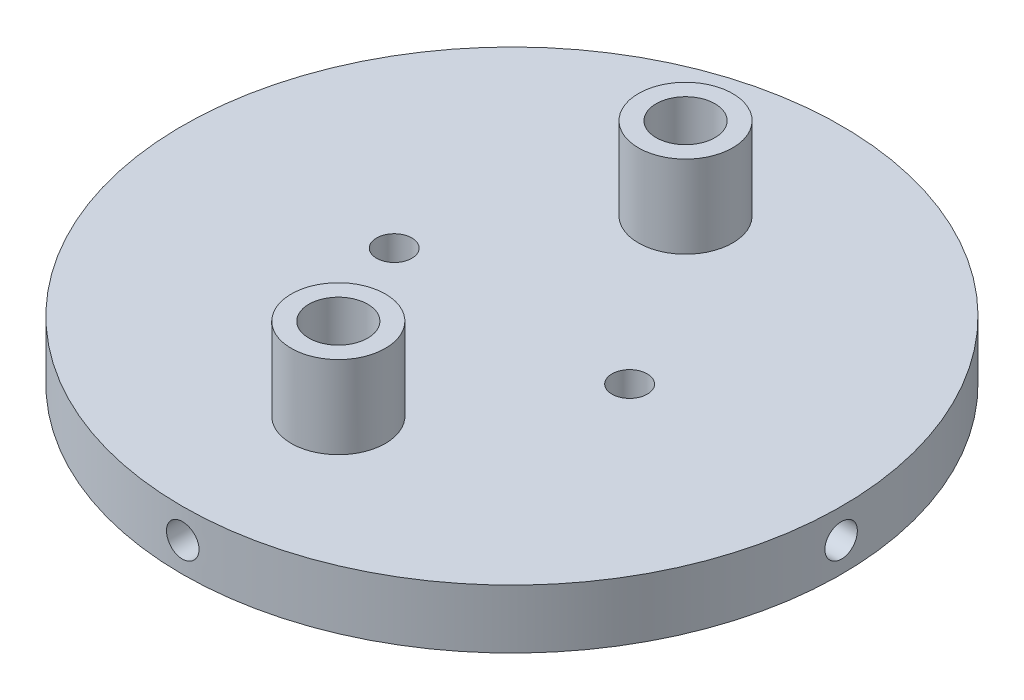
ISO-10303-21;
HEADER;
FILE_DESCRIPTION(('STEP AP214'),'2;1');
FILE_NAME('part.step','',(''),(''),'','','');
FILE_SCHEMA(('AUTOMOTIVE_DESIGN { 1 0 10303 214 1 1 1 1 }'));
ENDSEC;
DATA;
#1=APPLICATION_CONTEXT('core data for automotive mechanical design processes');
#2=APPLICATION_PROTOCOL_DEFINITION('international standard','automotive_design',2000,#1);
#3=PRODUCT_CONTEXT('',#1,'mechanical');
#4=PRODUCT('Part','Part','',(#3));
#5=PRODUCT_RELATED_PRODUCT_CATEGORY('part','',(#4));
#6=PRODUCT_DEFINITION_FORMATION('','',#4);
#7=PRODUCT_DEFINITION_CONTEXT('part definition',#1,'design');
#8=PRODUCT_DEFINITION('design','',#6,#7);
#9=PRODUCT_DEFINITION_SHAPE('','',#8);
#10=(LENGTH_UNIT() NAMED_UNIT(*) SI_UNIT(.MILLI.,.METRE.));
#11=(NAMED_UNIT(*) PLANE_ANGLE_UNIT() SI_UNIT($,.RADIAN.));
#12=(NAMED_UNIT(*) SI_UNIT($,.STERADIAN.) SOLID_ANGLE_UNIT());
#13=UNCERTAINTY_MEASURE_WITH_UNIT(LENGTH_MEASURE(1.E-05),#10,'distance_accuracy_value','');
#14=(GEOMETRIC_REPRESENTATION_CONTEXT(3) GLOBAL_UNCERTAINTY_ASSIGNED_CONTEXT((#13)) GLOBAL_UNIT_ASSIGNED_CONTEXT((#10,
#11,#12)) REPRESENTATION_CONTEXT('',''));
#15=CARTESIAN_POINT('',(0.,0.,0.));
#16=DIRECTION('',(0.,0.,1.));
#17=DIRECTION('',(1.,0.,0.));
#18=AXIS2_PLACEMENT_3D('',#15,#16,#17);
#19=CARTESIAN_POINT('',(0.,6.35,0.));
#20=DIRECTION('',(0.,-1.,0.));
#21=DIRECTION('',(0.,0.,-1.));
#22=AXIS2_PLACEMENT_3D('',#19,#20,#21);
#23=CYLINDRICAL_SURFACE('',#22,35.56);
#24=CARTESIAN_POINT('',(1.75260000000002,3.175,35.5167846692236));
#25=CARTESIAN_POINT('',(1.75259565748174,3.07661985264155,35.5167852498599));
#26=CARTESIAN_POINT('',(1.74428849712468,2.97816989228284,35.517197826552));
#27=CARTESIAN_POINT('',(1.71126732995226,2.78398573728596,35.5188038486097));
#28=CARTESIAN_POINT('',(1.68653397994158,2.68825488337661,35.5199982145728));
#29=CARTESIAN_POINT('',(1.62137019269568,2.50235000214616,35.5230321965141));
#30=CARTESIAN_POINT('',(1.58094774311842,2.41217317417732,35.5248714841029));
#31=CARTESIAN_POINT('',(1.48556542875144,2.2399092758522,35.5289876438377));
#32=CARTESIAN_POINT('',(1.43060900066078,2.15782029933565,35.5312644125024));
#33=CARTESIAN_POINT('',(1.3076582223125,2.00395675455581,35.5360015585401));
#34=CARTESIAN_POINT('',(1.23965265226458,1.9321911560295,35.5384620927965));
#35=CARTESIAN_POINT('',(1.09255637307995,1.80108797575915,35.5432880338743));
#36=CARTESIAN_POINT('',(1.01346521217627,1.74175090075604,35.5456534368139));
#37=CARTESIAN_POINT('',(0.846396334855018,1.63716477394104,35.5500237525702));
#38=CARTESIAN_POINT('',(0.758414272885256,1.59192265577467,35.5520284877616));
#39=CARTESIAN_POINT('',(0.576091687714351,1.51685521652007,35.5554499785934));
#40=CARTESIAN_POINT('',(0.481751211634678,1.48702978119479,35.5568667385906));
#41=CARTESIAN_POINT('',(0.289471817195192,1.44366589096916,35.5589515795177));
#42=CARTESIAN_POINT('',(0.191535914619937,1.43011409375883,35.5596202737355));
#43=CARTESIAN_POINT('',(-0.00522278880340807,1.41964099207441,35.5601356835175));
#44=CARTESIAN_POINT('',(-0.10404558281864,1.422719559585,35.559982405409));
#45=CARTESIAN_POINT('',(-0.299682507959631,1.44540872022766,35.5588716603791));
#46=CARTESIAN_POINT('',(-0.396498309274552,1.46500495111244,35.5579148921017));
#47=CARTESIAN_POINT('',(-0.585464506105232,1.52015091145531,35.5553057425343));
#48=CARTESIAN_POINT('',(-0.677614882467505,1.55570070640342,35.5536533583888));
#49=CARTESIAN_POINT('',(-0.854680665274876,1.64176104699676,35.5498379086647));
#50=CARTESIAN_POINT('',(-0.939592885375323,1.69227813811922,35.5476746197421));
#51=CARTESIAN_POINT('',(-1.09973717871644,1.80683429312375,35.543080988105));
#52=CARTESIAN_POINT('',(-1.17496918563918,1.87087344963586,35.5406506435611));
#53=CARTESIAN_POINT('',(-1.31370125336173,2.01073709632467,35.5357935519409));
#54=CARTESIAN_POINT('',(-1.3771887529248,2.08657404701148,35.5333668114387));
#55=CARTESIAN_POINT('',(-1.49053286475763,2.24783676779311,35.5287931102323));
#56=CARTESIAN_POINT('',(-1.54038947348171,2.33326254038218,35.5266461496009));
#57=CARTESIAN_POINT('',(-1.62505544885416,2.51128553954154,35.5228743163687));
#58=CARTESIAN_POINT('',(-1.65986434604472,2.60388298974724,35.521249460057));
#59=CARTESIAN_POINT('',(-1.71343842513358,2.79361742812011,35.5187056949691));
#60=CARTESIAN_POINT('',(-1.73220372427588,2.89075438310785,35.5177867810339));
#61=CARTESIAN_POINT('',(-1.75314239893088,3.08670105298232,35.5167594791941));
#62=CARTESIAN_POINT('',(-1.75533320749854,3.1855089007237,35.516650239676));
#63=CARTESIAN_POINT('',(-1.74310620281234,3.3820887380129,35.5172523822966));
#64=CARTESIAN_POINT('',(-1.72868844289776,3.4798607308864,35.5179637617999));
#65=CARTESIAN_POINT('',(-1.68366802640658,3.67154451531251,35.520126185297));
#66=CARTESIAN_POINT('',(-1.65307334665796,3.76545818482633,35.5215768647298));
#67=CARTESIAN_POINT('',(-1.57657563468257,3.94681730028211,35.5250540720692));
#68=CARTESIAN_POINT('',(-1.53067251641459,4.03426270986579,35.5270806032124));
#69=CARTESIAN_POINT('',(-1.42481619788519,4.20028325837599,35.5314831765588));
#70=CARTESIAN_POINT('',(-1.36485128598656,4.27885092202821,35.5338595094836));
#71=CARTESIAN_POINT('',(-1.23259067801519,4.42481054123364,35.5386928243905));
#72=CARTESIAN_POINT('',(-1.160294905215,4.49220242724164,35.5411498068743));
#73=CARTESIAN_POINT('',(-1.00534992011121,4.6139560474327,35.5458699820804));
#74=CARTESIAN_POINT('',(-0.922691854216096,4.66830652185362,35.5481330062663));
#75=CARTESIAN_POINT('',(-0.749413409746863,4.7623575341947,35.5522078085963));
#76=CARTESIAN_POINT('',(-0.658793065094452,4.802058134524,35.5540195886628));
#77=CARTESIAN_POINT('',(-0.472204353385614,4.86566275208892,35.5569869071518));
#78=CARTESIAN_POINT('',(-0.376238448098622,4.88957397658114,35.5581427449532));
#79=CARTESIAN_POINT('',(-0.181648250536128,4.9209446942958,35.5596691057493));
#80=CARTESIAN_POINT('',(-0.0830239727004411,4.92840427686247,35.5600396330087));
#81=CARTESIAN_POINT('',(0.113971607472735,4.92665910268187,35.5599536336804));
#82=CARTESIAN_POINT('',(0.21234306717315,4.91747201053862,35.5594979837896));
#83=CARTESIAN_POINT('',(0.406145184380198,4.88273078389109,35.5578126535167));
#84=CARTESIAN_POINT('',(0.501575836331461,4.85717661847037,35.5565829716725));
#85=CARTESIAN_POINT('',(0.686791181041931,4.79043022165202,35.5534879313447));
#86=CARTESIAN_POINT('',(0.776575829073077,4.74923786638569,35.551622567826));
#87=CARTESIAN_POINT('',(0.947955875937594,4.65238751010222,35.5474659664367));
#88=CARTESIAN_POINT('',(1.02955152802435,4.59672995662788,35.5451747417426));
#89=CARTESIAN_POINT('',(1.18232549419748,4.47246608048212,35.5404215493862));
#90=CARTESIAN_POINT('',(1.25349382142881,4.40384748637129,35.5379594213224));
#91=CARTESIAN_POINT('',(1.38332292689591,4.25561662367362,35.5331429863574));
#92=CARTESIAN_POINT('',(1.44198062262948,4.17600165362592,35.5307887061409));
#93=CARTESIAN_POINT('',(1.54515013231447,4.00797678396374,35.5264519514601));
#94=CARTESIAN_POINT('',(1.58964851435119,3.91955863716084,35.5244698307627));
#95=CARTESIAN_POINT('',(1.66311553994467,3.73656275288202,35.5211065695754));
#96=CARTESIAN_POINT('',(1.69210253472609,3.64199244321005,35.519724719283));
#97=CARTESIAN_POINT('',(1.72611708279803,3.48486176583137,35.5180838625486));
#98=CARTESIAN_POINT('',(1.73603550572586,3.42331926608273,35.5175988122841));
#99=CARTESIAN_POINT('',(1.74927833605916,3.29952716914497,35.5169490319747));
#100=CARTESIAN_POINT('',(1.75260274894382,3.23727757254344,35.5167843016635));
#101=CARTESIAN_POINT('',(1.75260000000002,3.175,35.5167846692236));
#102=B_SPLINE_CURVE_WITH_KNOTS('',3,(#24,#25,#26,#27,#28,#29,#30,#31,#32,#33,#34,#35,#36,#37,
#38,#39,#40,#41,#42,#43,#44,#45,#46,#47,#48,#49,#50,#51,#52,#53,#54,#55,#56,#57,#58,#59,#60,#61,
#62,#63,#64,#65,#66,#67,#68,#69,#70,#71,#72,#73,#74,#75,#76,#77,#78,#79,#80,#81,#82,#83,#84,#85,
#86,#87,#88,#89,#90,#91,#92,#93,#94,#95,#96,#97,#98,#99,#100,#101),.UNSPECIFIED.,.T.,.F.,(4,2,2,
2,2,2,2,2,2,2,2,2,2,2,2,2,2,2,2,2,2,2,2,2,2,2,2,2,2,2,2,2,2,2,2,2,2,2,4),(0.,0.29491310564371,
0.590174113071641,0.885284993540475,1.18032615449809,1.47562214098343,1.77093016505713,
2.06638322964928,2.36183410491369,2.65704258235578,2.95224878737911,3.24719857259496,
3.5421495686026,3.83722974304003,4.13231193892732,4.42770793543048,4.72310400877219,
5.01850929720166,5.31391242683889,5.60900480810767,5.90409624167445,6.19904230137218,
6.49399001884486,6.78918426723068,7.08438035249766,7.37983039596048,7.6752791807781,
7.97059301093437,8.26590523732063,8.56090427690143,8.85590387371975,9.15090580725236,
9.44589861472427,9.74117213254942,10.0365183191666,10.3321438497632,10.6274188538465,
10.8141078158496,11.0007966227267),.UNSPECIFIED.);
#103=CARTESIAN_POINT('',(1.75260000000002,3.175,35.5167846692236));
#104=VERTEX_POINT('',#103);
#105=EDGE_CURVE('E45',#104,#104,#102,.T.);
#106=ORIENTED_EDGE('',*,*,#105,.T.);
#107=EDGE_LOOP('',(#106));
#108=FACE_BOUND('',#107,.T.);
#109=CARTESIAN_POINT('',(-35.5167846692236,3.175,1.7526));
#110=CARTESIAN_POINT('',(-35.5167852498599,3.07661985264155,1.75259565748173));
#111=CARTESIAN_POINT('',(-35.517197826552,2.97816989228284,1.74428849712466));
#112=CARTESIAN_POINT('',(-35.5188038486097,2.78398573728596,1.71126732995224));
#113=CARTESIAN_POINT('',(-35.5199982145728,2.68825488337661,1.68653397994156));
#114=CARTESIAN_POINT('',(-35.5230321965141,2.50235000214616,1.62137019269566));
#115=CARTESIAN_POINT('',(-35.5248714841029,2.41217317417732,1.5809477431184));
#116=CARTESIAN_POINT('',(-35.5289876438377,2.2399092758522,1.48556542875142));
#117=CARTESIAN_POINT('',(-35.5312644125024,2.15782029933565,1.43060900066076));
#118=CARTESIAN_POINT('',(-35.5360015585401,2.00395675455581,1.30765822231248));
#119=CARTESIAN_POINT('',(-35.5384620927965,1.9321911560295,1.23965265226456));
#120=CARTESIAN_POINT('',(-35.5432880338743,1.80108797575915,1.09255637307993));
#121=CARTESIAN_POINT('',(-35.5456534368139,1.74175090075604,1.01346521217625));
#122=CARTESIAN_POINT('',(-35.5500237525702,1.63716477394104,0.846396334855001));
#123=CARTESIAN_POINT('',(-35.5520284877616,1.59192265577467,0.758414272885239));
#124=CARTESIAN_POINT('',(-35.5554499785934,1.51685521652007,0.576091687714333));
#125=CARTESIAN_POINT('',(-35.5568667385906,1.48702978119479,0.48175121163466));
#126=CARTESIAN_POINT('',(-35.5589515795177,1.44366589096916,0.289471817195175));
#127=CARTESIAN_POINT('',(-35.5596202737355,1.43011409375883,0.191535914619919));
#128=CARTESIAN_POINT('',(-35.5601356835175,1.41964099207441,-0.00522278880342564));
#129=CARTESIAN_POINT('',(-35.559982405409,1.422719559585,-0.104045582818658));
#130=CARTESIAN_POINT('',(-35.5588716603791,1.44540872022766,-0.299682507959649));
#131=CARTESIAN_POINT('',(-35.5579148921017,1.46500495111244,-0.39649830927457));
#132=CARTESIAN_POINT('',(-35.5553057425343,1.52015091145531,-0.585464506105249));
#133=CARTESIAN_POINT('',(-35.5536533583888,1.55570070640342,-0.677614882467522));
#134=CARTESIAN_POINT('',(-35.5498379086647,1.64176104699676,-0.854680665274893));
#135=CARTESIAN_POINT('',(-35.5476746197421,1.69227813811922,-0.939592885375341));
#136=CARTESIAN_POINT('',(-35.543080988105,1.80683429312375,-1.09973717871646));
#137=CARTESIAN_POINT('',(-35.5406506435611,1.87087344963586,-1.17496918563919));
#138=CARTESIAN_POINT('',(-35.5357935519409,2.01073709632467,-1.31370125336175));
#139=CARTESIAN_POINT('',(-35.5333668114387,2.08657404701148,-1.37718875292482));
#140=CARTESIAN_POINT('',(-35.5287931102323,2.24783676779311,-1.49053286475765));
#141=CARTESIAN_POINT('',(-35.5266461496009,2.33326254038218,-1.54038947348173));
#142=CARTESIAN_POINT('',(-35.5228743163687,2.51128553954154,-1.62505544885417));
#143=CARTESIAN_POINT('',(-35.521249460057,2.60388298974724,-1.65986434604474));
#144=CARTESIAN_POINT('',(-35.5187056949691,2.79361742812011,-1.7134384251336));
#145=CARTESIAN_POINT('',(-35.5177867810339,2.89075438310785,-1.7322037242759));
#146=CARTESIAN_POINT('',(-35.5167594791941,3.08670105298232,-1.75314239893089));
#147=CARTESIAN_POINT('',(-35.516650239676,3.1855089007237,-1.75533320749856));
#148=CARTESIAN_POINT('',(-35.5172523822966,3.3820887380129,-1.74310620281236));
#149=CARTESIAN_POINT('',(-35.5179637617999,3.4798607308864,-1.72868844289778));
#150=CARTESIAN_POINT('',(-35.520126185297,3.67154451531251,-1.6836680264066));
#151=CARTESIAN_POINT('',(-35.5215768647298,3.76545818482633,-1.65307334665798));
#152=CARTESIAN_POINT('',(-35.5250540720692,3.94681730028211,-1.57657563468259));
#153=CARTESIAN_POINT('',(-35.5270806032124,4.03426270986579,-1.53067251641461));
#154=CARTESIAN_POINT('',(-35.5314831765588,4.20028325837599,-1.42481619788521));
#155=CARTESIAN_POINT('',(-35.5338595094836,4.27885092202821,-1.36485128598658));
#156=CARTESIAN_POINT('',(-35.5386928243905,4.42481054123364,-1.23259067801521));
#157=CARTESIAN_POINT('',(-35.5411498068743,4.49220242724164,-1.16029490521502));
#158=CARTESIAN_POINT('',(-35.5458699820804,4.6139560474327,-1.00534992011123));
#159=CARTESIAN_POINT('',(-35.5481330062663,4.66830652185362,-0.922691854216115));
#160=CARTESIAN_POINT('',(-35.5522078085963,4.7623575341947,-0.749413409746882));
#161=CARTESIAN_POINT('',(-35.5540195886628,4.802058134524,-0.658793065094471));
#162=CARTESIAN_POINT('',(-35.5569869071518,4.86566275208892,-0.472204353385632));
#163=CARTESIAN_POINT('',(-35.5581427449532,4.88957397658114,-0.37623844809864));
#164=CARTESIAN_POINT('',(-35.5596691057493,4.9209446942958,-0.181648250536146));
#165=CARTESIAN_POINT('',(-35.5600396330087,4.92840427686247,-0.0830239727004598));
#166=CARTESIAN_POINT('',(-35.5599536336804,4.92665910268187,0.113971607472717));
#167=CARTESIAN_POINT('',(-35.5594979837896,4.91747201053862,0.212343067173132));
#168=CARTESIAN_POINT('',(-35.5578126535167,4.8827307838911,0.40614518438018));
#169=CARTESIAN_POINT('',(-35.5565829716725,4.85717661847037,0.501575836331443));
#170=CARTESIAN_POINT('',(-35.5534879313447,4.79043022165202,0.686791181041913));
#171=CARTESIAN_POINT('',(-35.551622567826,4.74923786638569,0.776575829073059));
#172=CARTESIAN_POINT('',(-35.5474659664367,4.65238751010222,0.947955875937576));
#173=CARTESIAN_POINT('',(-35.5451747417426,4.59672995662788,1.02955152802433));
#174=CARTESIAN_POINT('',(-35.5404215493862,4.47246608048212,1.18232549419747));
#175=CARTESIAN_POINT('',(-35.5379594213224,4.40384748637129,1.25349382142879));
#176=CARTESIAN_POINT('',(-35.5331429863574,4.25561662367362,1.38332292689589));
#177=CARTESIAN_POINT('',(-35.5307887061409,4.17600165362592,1.44198062262946));
#178=CARTESIAN_POINT('',(-35.5264519514601,4.00797678396374,1.54515013231446));
#179=CARTESIAN_POINT('',(-35.5244698307627,3.91955863716084,1.58964851435117));
#180=CARTESIAN_POINT('',(-35.5211065695754,3.73656275288203,1.66311553994465));
#181=CARTESIAN_POINT('',(-35.519724719283,3.64199244321005,1.69210253472607));
#182=CARTESIAN_POINT('',(-35.5180838625486,3.48486176583137,1.72611708279802));
#183=CARTESIAN_POINT('',(-35.5175988122841,3.42331926608273,1.73603550572584));
#184=CARTESIAN_POINT('',(-35.5169490319747,3.29952716914497,1.74927833605915));
#185=CARTESIAN_POINT('',(-35.5167843016635,3.23727757254344,1.75260274894381));
#186=CARTESIAN_POINT('',(-35.5167846692236,3.175,1.7526));
#187=B_SPLINE_CURVE_WITH_KNOTS('',3,(#109,#110,#111,#112,#113,#114,#115,#116,#117,#118,#119,
#120,#121,#122,#123,#124,#125,#126,#127,#128,#129,#130,#131,#132,#133,#134,#135,#136,#137,#138,
#139,#140,#141,#142,#143,#144,#145,#146,#147,#148,#149,#150,#151,#152,#153,#154,#155,#156,#157,
#158,#159,#160,#161,#162,#163,#164,#165,#166,#167,#168,#169,#170,#171,#172,#173,#174,#175,#176,
#177,#178,#179,#180,#181,#182,#183,#184,#185,#186),.UNSPECIFIED.,.T.,.F.,(4,2,2,2,2,2,2,2,2,2,2,
2,2,2,2,2,2,2,2,2,2,2,2,2,2,2,2,2,2,2,2,2,2,2,2,2,2,2,4),(0.,0.29491310564371,0.590174113071641,
0.885284993540474,1.18032615449809,1.47562214098343,1.77093016505713,2.06638322964928,
2.36183410491369,2.65704258235578,2.95224878737911,3.24719857259496,3.5421495686026,
3.83722974304003,4.13231193892732,4.42770793543048,4.72310400877219,5.01850929720166,
5.31391242683889,5.60900480810767,5.90409624167445,6.19904230137219,6.49399001884486,
6.78918426723068,7.08438035249766,7.37983039596048,7.6752791807781,7.97059301093438,
8.26590523732063,8.56090427690143,8.85590387371975,9.15090580725236,9.44589861472428,
9.74117213254942,10.0365183191666,10.3321438497632,10.6274188538465,10.8141078158496,
11.0007966227267),.UNSPECIFIED.);
#188=CARTESIAN_POINT('',(-35.5167846692236,3.175,1.7526));
#189=VERTEX_POINT('',#188);
#190=EDGE_CURVE('E154',#189,#189,#187,.T.);
#191=ORIENTED_EDGE('',*,*,#190,.T.);
#192=EDGE_LOOP('',(#191));
#193=FACE_BOUND('',#192,.T.);
#194=CARTESIAN_POINT('',(0.,4.9276,-35.56));
#195=CARTESIAN_POINT('',(-0.0983802291936352,4.92759565755605,-35.5599994219985));
#196=CARTESIAN_POINT('',(-0.196830271108554,4.91928848384639,-35.5595873592893));
#197=CARTESIAN_POINT('',(-0.391014595567187,4.88626725881109,-35.5579831734438));
#198=CARTESIAN_POINT('',(-0.486745537445925,4.86153386456723,-35.5567901306777));
#199=CARTESIAN_POINT('',(-0.672650604626898,4.79636994790484,-35.5537590205327));
#200=CARTESIAN_POINT('',(-0.762827529831678,4.75594741103382,-35.5519212813405));
#201=CARTESIAN_POINT('',(-0.935091590835963,4.66056489114558,-35.5478077663485));
#202=CARTESIAN_POINT('',(-1.01718063291898,4.60560834504409,-35.5455320941429));
#203=CARTESIAN_POINT('',(-1.17104410266456,4.48265744790439,-35.5407962153809));
#204=CARTESIAN_POINT('',(-1.24280958159614,4.41465190339939,-35.5383358515066));
#205=CARTESIAN_POINT('',(-1.37391253133227,4.26755572538041,-35.5335092448212));
#206=CARTESIAN_POINT('',(-1.43324949502956,4.18846463977478,-35.5311430058539));
#207=CARTESIAN_POINT('',(-1.53783550622896,4.02139582743557,-35.5267703741939));
#208=CARTESIAN_POINT('',(-1.58307759942614,3.93341374221048,-35.5247641593409));
#209=CARTESIAN_POINT('',(-1.65814498608772,3.75109110647012,-35.5213397180878));
#210=CARTESIAN_POINT('',(-1.68797039409191,3.65675060320123,-35.5199214873191));
#211=CARTESIAN_POINT('',(-1.73133422607455,3.46447112954339,-35.5178343605855));
#212=CARTESIAN_POINT('',(-1.74488599036769,3.36653517449752,-35.5171648508877));
#213=CARTESIAN_POINT('',(-1.75535900804197,3.16977636863586,-35.5166488223706));
#214=CARTESIAN_POINT('',(-1.75228038978589,3.07095352467146,-35.5168022971991));
#215=CARTESIAN_POINT('',(-1.7295911496435,2.87531682558643,-35.5179143601368));
#216=CARTESIAN_POINT('',(-1.70999494106321,2.77850129431971,-35.5188722463111));
#217=CARTESIAN_POINT('',(-1.65484911926599,2.58953562609783,-35.5214840623631));
#218=CARTESIAN_POINT('',(-1.619299440062,2.4973855084416,-35.5231379951197));
#219=CARTESIAN_POINT('',(-1.53323933737755,2.32032003596024,-35.5269562993211));
#220=CARTESIAN_POINT('',(-1.48272234112627,2.23540788076458,-35.5291208949338));
#221=CARTESIAN_POINT('',(-1.36816638767416,2.07526367683178,-35.533716323019));
#222=CARTESIAN_POINT('',(-1.30412733790252,2.00003169436994,-35.5361471573141));
#223=CARTESIAN_POINT('',(-1.16426376589558,1.86129950293786,-35.5410042018898));
#224=CARTESIAN_POINT('',(-1.08842676162411,1.7978118768446,-35.5434304044861));
#225=CARTESIAN_POINT('',(-0.927163888926762,1.68446753540475,-35.5480022321837));
#226=CARTESIAN_POINT('',(-0.841738018185195,1.63461082334999,-35.5501478572173));
#227=CARTESIAN_POINT('',(-0.663714994646261,1.54994477401755,-35.5539168031496));
#228=CARTESIAN_POINT('',(-0.57111763359593,1.51513587390673,-35.5555401088735));
#229=CARTESIAN_POINT('',(-0.381383388679273,1.46156176156002,-35.5580812431837));
#230=CARTESIAN_POINT('',(-0.284246537842983,1.44279643260778,-35.5589990769023));
#231=CARTESIAN_POINT('',(-0.0882999128859692,1.42185764587093,-35.5600251652618));
#232=CARTESIAN_POINT('',(0.0105079971264113,1.41966678338142,-35.5601342691407));
#233=CARTESIAN_POINT('',(0.207087971988984,1.43189370246011,-35.5595328560243));
#234=CARTESIAN_POINT('',(0.304860040165148,1.44631143068368,-35.5588223416615));
#235=CARTESIAN_POINT('',(0.496544181311631,1.49133185935453,-35.556662268026));
#236=CARTESIAN_POINT('',(0.590458124740743,1.52192661478895,-35.5552130715545));
#237=CARTESIAN_POINT('',(0.771817754445081,1.59842457009321,-35.5517387997729));
#238=CARTESIAN_POINT('',(0.859263404548951,1.64432785556202,-35.5497137212429));
#239=CARTESIAN_POINT('',(1.02528411147932,1.75018441708132,-35.5453133951609));
#240=CARTESIAN_POINT('',(1.10385172016371,1.81014936222601,-35.5429378573903));
#241=CARTESIAN_POINT('',(1.24981121293105,1.9424100056554,-35.5381051203537));
#242=CARTESIAN_POINT('',(1.31720302723442,2.01470578092578,-35.5356479205781));
#243=CARTESIAN_POINT('',(1.43895650024278,2.16965073362179,-35.5309263930996));
#244=CARTESIAN_POINT('',(1.49330689942494,2.25230876441812,-35.5286622331402));
#245=CARTESIAN_POINT('',(1.58735777958946,2.42558711936228,-35.5245847380342));
#246=CARTESIAN_POINT('',(1.62705832297741,2.51620740959038,-35.5227714009672));
#247=CARTESIAN_POINT('',(1.69066290113323,2.70279616196548,-35.5198012289192));
#248=CARTESIAN_POINT('',(1.71457411853316,2.79876217074838,-35.5186440954623));
#249=CARTESIAN_POINT('',(1.74594478696655,2.99335258595711,-35.5171159759293));
#250=CARTESIAN_POINT('',(1.75340432789203,3.09197697785456,-35.5167449855576));
#251=CARTESIAN_POINT('',(1.75165903556183,3.28897248029566,-35.5168310951867));
#252=CARTESIAN_POINT('',(1.74247191647223,3.38734374865679,-35.5172873149309));
#253=CARTESIAN_POINT('',(1.70773070340058,3.58114547665607,-35.5189745651462));
#254=CARTESIAN_POINT('',(1.68217657815881,3.67657593067714,-35.5202055970971));
#255=CARTESIAN_POINT('',(1.61543033268378,3.86179089045634,-35.5233035269703));
#256=CARTESIAN_POINT('',(1.57423808867415,3.95157535151964,-35.5251704299255));
#257=CARTESIAN_POINT('',(1.47738801251041,4.122955071113,-35.5293296257034));
#258=CARTESIAN_POINT('',(1.42173062769699,4.20455058278169,-35.5316219053705));
#259=CARTESIAN_POINT('',(1.29746693335908,4.35732456597216,-35.5363762696639));
#260=CARTESIAN_POINT('',(1.22884831409021,4.42849301951069,-35.5388385142897));
#261=CARTESIAN_POINT('',(1.08061734962977,4.55832236802268,-35.5436541849854));
#262=CARTESIAN_POINT('',(1.00100230325088,4.6169801808191,-35.546007584128));
#263=CARTESIAN_POINT('',(0.832977375179936,4.72014981229121,-35.5503419602516));
#264=CARTESIAN_POINT('',(0.744559259885925,4.76464822120643,-35.5523225834718));
#265=CARTESIAN_POINT('',(0.561563443162385,4.83811530586222,-35.5556828981096));
#266=CARTESIAN_POINT('',(0.466993169360232,4.8671023324067,-35.5570632992582));
#267=CARTESIAN_POINT('',(0.309862406578813,4.90111697268334,-35.5587023438774));
#268=CARTESIAN_POINT('',(0.248319779043796,4.91103543703093,-35.5591868275444));
#269=CARTESIAN_POINT('',(0.12452742591536,4.92427832241093,-35.5598358384197));
#270=CARTESIAN_POINT('',(0.0622777009071325,4.92760274890014,-35.5600003658927));
#271=CARTESIAN_POINT('',(0.,4.9276,-35.56));
#272=B_SPLINE_CURVE_WITH_KNOTS('',3,(#194,#195,#196,#197,#198,#199,#200,#201,#202,#203,#204,
#205,#206,#207,#208,#209,#210,#211,#212,#213,#214,#215,#216,#217,#218,#219,#220,#221,#222,#223,
#224,#225,#226,#227,#228,#229,#230,#231,#232,#233,#234,#235,#236,#237,#238,#239,#240,#241,#242,
#243,#244,#245,#246,#247,#248,#249,#250,#251,#252,#253,#254,#255,#256,#257,#258,#259,#260,#261,
#262,#263,#264,#265,#266,#267,#268,#269,#270,#271),.UNSPECIFIED.,.T.,.F.,(4,2,2,2,2,2,2,2,2,2,2,
2,2,2,2,2,2,2,2,2,2,2,2,2,2,2,2,2,2,2,2,2,2,2,2,2,2,2,4),(0.,0.294913351414361,
0.590174599254763,0.88528576003894,1.18032719700096,1.47562286198215,1.77093057324676,
2.06638375724458,2.36183474611224,2.65704337342258,2.95224972214737,3.24719873915607,
3.54214897614996,3.8372289305131,4.13231090503375,4.42770722146432,4.72310360923247,
5.01850857823734,5.31391139816415,5.60900397501202,5.90409560406367,6.19904243938776,
6.49399092395995,6.78918504370994,7.08438100652753,7.37983092199035,7.67527957887822,
7.97059374214645,8.26590629181303,8.5609047758536,8.85590382332018,9.15090520576515,
9.44589746625085,9.74117131300887,10.0365178209289,10.3321432119796,10.6274180846253,
10.8141074310766,11.0007966230356),.UNSPECIFIED.);
#273=CARTESIAN_POINT('',(0.,4.9276,-35.56));
#274=VERTEX_POINT('',#273);
#275=EDGE_CURVE('E79',#274,#274,#272,.T.);
#276=ORIENTED_EDGE('',*,*,#275,.T.);
#277=EDGE_LOOP('',(#276));
#278=FACE_BOUND('',#277,.T.);
#279=CARTESIAN_POINT('',(35.5167846692236,3.175,-1.7526));
#280=CARTESIAN_POINT('',(35.5167852498599,3.07661985264155,-1.75259565748173));
#281=CARTESIAN_POINT('',(35.517197826552,2.97816989228284,-1.74428849712466));
#282=CARTESIAN_POINT('',(35.5188038486097,2.78398573728596,-1.71126732995224));
#283=CARTESIAN_POINT('',(35.5199982145728,2.68825488337661,-1.68653397994156));
#284=CARTESIAN_POINT('',(35.5230321965141,2.50235000214616,-1.62137019269566));
#285=CARTESIAN_POINT('',(35.5248714841029,2.41217317417732,-1.5809477431184));
#286=CARTESIAN_POINT('',(35.5289876438377,2.2399092758522,-1.48556542875142));
#287=CARTESIAN_POINT('',(35.5312644125024,2.15782029933565,-1.43060900066076));
#288=CARTESIAN_POINT('',(35.5360015585401,2.00395675455581,-1.30765822231248));
#289=CARTESIAN_POINT('',(35.5384620927965,1.9321911560295,-1.23965265226456));
#290=CARTESIAN_POINT('',(35.5432880338743,1.80108797575915,-1.09255637307993));
#291=CARTESIAN_POINT('',(35.5456534368139,1.74175090075604,-1.01346521217625));
#292=CARTESIAN_POINT('',(35.5500237525702,1.63716477394104,-0.846396334855001));
#293=CARTESIAN_POINT('',(35.5520284877616,1.59192265577467,-0.758414272885239));
#294=CARTESIAN_POINT('',(35.5554499785934,1.51685521652007,-0.576091687714333));
#295=CARTESIAN_POINT('',(35.5568667385906,1.48702978119479,-0.48175121163466));
#296=CARTESIAN_POINT('',(35.5589515795177,1.44366589096916,-0.289471817195175));
#297=CARTESIAN_POINT('',(35.5596202737355,1.43011409375883,-0.191535914619919));
#298=CARTESIAN_POINT('',(35.5601356835175,1.41964099207441,0.00522278880342564));
#299=CARTESIAN_POINT('',(35.559982405409,1.422719559585,0.104045582818658));
#300=CARTESIAN_POINT('',(35.5588716603791,1.44540872022766,0.299682507959649));
#301=CARTESIAN_POINT('',(35.5579148921017,1.46500495111244,0.39649830927457));
#302=CARTESIAN_POINT('',(35.5553057425343,1.52015091145531,0.585464506105249));
#303=CARTESIAN_POINT('',(35.5536533583888,1.55570070640342,0.677614882467522));
#304=CARTESIAN_POINT('',(35.5498379086647,1.64176104699676,0.854680665274893));
#305=CARTESIAN_POINT('',(35.5476746197421,1.69227813811922,0.939592885375341));
#306=CARTESIAN_POINT('',(35.543080988105,1.80683429312375,1.09973717871646));
#307=CARTESIAN_POINT('',(35.5406506435611,1.87087344963586,1.17496918563919));
#308=CARTESIAN_POINT('',(35.5357935519409,2.01073709632467,1.31370125336175));
#309=CARTESIAN_POINT('',(35.5333668114387,2.08657404701148,1.37718875292482));
#310=CARTESIAN_POINT('',(35.5287931102323,2.24783676779311,1.49053286475765));
#311=CARTESIAN_POINT('',(35.5266461496009,2.33326254038218,1.54038947348173));
#312=CARTESIAN_POINT('',(35.5228743163687,2.51128553954154,1.62505544885417));
#313=CARTESIAN_POINT('',(35.521249460057,2.60388298974724,1.65986434604474));
#314=CARTESIAN_POINT('',(35.5187056949691,2.79361742812011,1.7134384251336));
#315=CARTESIAN_POINT('',(35.5177867810339,2.89075438310785,1.7322037242759));
#316=CARTESIAN_POINT('',(35.5167594791941,3.08670105298232,1.75314239893089));
#317=CARTESIAN_POINT('',(35.516650239676,3.1855089007237,1.75533320749856));
#318=CARTESIAN_POINT('',(35.5172523822966,3.3820887380129,1.74310620281236));
#319=CARTESIAN_POINT('',(35.5179637617999,3.4798607308864,1.72868844289778));
#320=CARTESIAN_POINT('',(35.520126185297,3.67154451531251,1.6836680264066));
#321=CARTESIAN_POINT('',(35.5215768647298,3.76545818482633,1.65307334665798));
#322=CARTESIAN_POINT('',(35.5250540720692,3.94681730028211,1.57657563468259));
#323=CARTESIAN_POINT('',(35.5270806032124,4.03426270986579,1.53067251641461));
#324=CARTESIAN_POINT('',(35.5314831765588,4.20028325837599,1.42481619788521));
#325=CARTESIAN_POINT('',(35.5338595094836,4.27885092202821,1.36485128598658));
#326=CARTESIAN_POINT('',(35.5386928243905,4.42481054123364,1.23259067801521));
#327=CARTESIAN_POINT('',(35.5411498068743,4.49220242724164,1.16029490521502));
#328=CARTESIAN_POINT('',(35.5458699820804,4.6139560474327,1.00534992011123));
#329=CARTESIAN_POINT('',(35.5481330062663,4.66830652185362,0.922691854216115));
#330=CARTESIAN_POINT('',(35.5522078085963,4.7623575341947,0.749413409746882));
#331=CARTESIAN_POINT('',(35.5540195886628,4.802058134524,0.658793065094471));
#332=CARTESIAN_POINT('',(35.5569869071518,4.86566275208892,0.472204353385632));
#333=CARTESIAN_POINT('',(35.5581427449532,4.88957397658114,0.37623844809864));
#334=CARTESIAN_POINT('',(35.5596691057493,4.9209446942958,0.181648250536146));
#335=CARTESIAN_POINT('',(35.5600396330087,4.92840427686247,0.0830239727004598));
#336=CARTESIAN_POINT('',(35.5599536336804,4.92665910268187,-0.113971607472717));
#337=CARTESIAN_POINT('',(35.5594979837896,4.91747201053862,-0.212343067173132));
#338=CARTESIAN_POINT('',(35.5578126535167,4.8827307838911,-0.40614518438018));
#339=CARTESIAN_POINT('',(35.5565829716725,4.85717661847037,-0.501575836331443));
#340=CARTESIAN_POINT('',(35.5534879313447,4.79043022165202,-0.686791181041913));
#341=CARTESIAN_POINT('',(35.551622567826,4.74923786638569,-0.776575829073059));
#342=CARTESIAN_POINT('',(35.5474659664367,4.65238751010222,-0.947955875937576));
#343=CARTESIAN_POINT('',(35.5451747417426,4.59672995662788,-1.02955152802433));
#344=CARTESIAN_POINT('',(35.5404215493862,4.47246608048212,-1.18232549419747));
#345=CARTESIAN_POINT('',(35.5379594213224,4.40384748637129,-1.25349382142879));
#346=CARTESIAN_POINT('',(35.5331429863574,4.25561662367362,-1.38332292689589));
#347=CARTESIAN_POINT('',(35.5307887061409,4.17600165362592,-1.44198062262946));
#348=CARTESIAN_POINT('',(35.5264519514601,4.00797678396374,-1.54515013231446));
#349=CARTESIAN_POINT('',(35.5244698307627,3.91955863716084,-1.58964851435117));
#350=CARTESIAN_POINT('',(35.5211065695754,3.73656275288203,-1.66311553994465));
#351=CARTESIAN_POINT('',(35.519724719283,3.64199244321005,-1.69210253472607));
#352=CARTESIAN_POINT('',(35.5180838625486,3.48486176583137,-1.72611708279802));
#353=CARTESIAN_POINT('',(35.5175988122841,3.42331926608273,-1.73603550572584));
#354=CARTESIAN_POINT('',(35.5169490319747,3.29952716914497,-1.74927833605915));
#355=CARTESIAN_POINT('',(35.5167843016635,3.23727757254344,-1.75260274894381));
#356=CARTESIAN_POINT('',(35.5167846692236,3.175,-1.7526));
#357=B_SPLINE_CURVE_WITH_KNOTS('',3,(#279,#280,#281,#282,#283,#284,#285,#286,#287,#288,#289,
#290,#291,#292,#293,#294,#295,#296,#297,#298,#299,#300,#301,#302,#303,#304,#305,#306,#307,#308,
#309,#310,#311,#312,#313,#314,#315,#316,#317,#318,#319,#320,#321,#322,#323,#324,#325,#326,#327,
#328,#329,#330,#331,#332,#333,#334,#335,#336,#337,#338,#339,#340,#341,#342,#343,#344,#345,#346,
#347,#348,#349,#350,#351,#352,#353,#354,#355,#356),.UNSPECIFIED.,.T.,.F.,(4,2,2,2,2,2,2,2,2,2,2,
2,2,2,2,2,2,2,2,2,2,2,2,2,2,2,2,2,2,2,2,2,2,2,2,2,2,2,4),(0.,0.29491310564371,0.590174113071641,
0.885284993540474,1.18032615449809,1.47562214098343,1.77093016505713,2.06638322964928,
2.36183410491369,2.65704258235578,2.95224878737911,3.24719857259496,3.5421495686026,
3.83722974304003,4.13231193892732,4.42770793543048,4.72310400877219,5.01850929720166,
5.31391242683889,5.60900480810767,5.90409624167445,6.19904230137219,6.49399001884486,
6.78918426723068,7.08438035249766,7.37983039596048,7.6752791807781,7.97059301093438,
8.26590523732063,8.56090427690143,8.85590387371975,9.15090580725236,9.44589861472428,
9.74117213254942,10.0365183191666,10.3321438497632,10.6274188538465,10.8141078158496,
11.0007966227267),.UNSPECIFIED.);
#358=CARTESIAN_POINT('',(35.5167846692236,3.175,-1.7526));
#359=VERTEX_POINT('',#358);
#360=EDGE_CURVE('E70',#359,#359,#357,.T.);
#361=ORIENTED_EDGE('',*,*,#360,.T.);
#362=EDGE_LOOP('',(#361));
#363=FACE_BOUND('',#362,.T.);
#364=CARTESIAN_POINT('',(0.,6.35,0.));
#365=DIRECTION('',(0.,1.,0.));
#366=DIRECTION('',(0.,0.,1.));
#367=AXIS2_PLACEMENT_3D('',#364,#365,#366);
#368=CIRCLE('',#367,35.56);
#369=CARTESIAN_POINT('',(0.,6.35,35.56));
#370=VERTEX_POINT('',#369);
#371=EDGE_CURVE('E53',#370,#370,#368,.T.);
#372=ORIENTED_EDGE('',*,*,#371,.F.);
#373=EDGE_LOOP('',(#372));
#374=FACE_BOUND('',#373,.T.);
#375=CARTESIAN_POINT('',(0.,0.,0.));
#376=DIRECTION('',(0.,1.,0.));
#377=DIRECTION('',(0.,0.,1.));
#378=AXIS2_PLACEMENT_3D('',#375,#376,#377);
#379=CIRCLE('',#378,35.56);
#380=CARTESIAN_POINT('',(0.,0.,35.56));
#381=VERTEX_POINT('',#380);
#382=EDGE_CURVE('E58',#381,#381,#379,.T.);
#383=ORIENTED_EDGE('',*,*,#382,.T.);
#384=EDGE_LOOP('',(#383));
#385=FACE_BOUND('',#384,.T.);
#386=ADVANCED_FACE('F41',(#108,#193,#278,#363,#374,#385),#23,.T.);
#387=CARTESIAN_POINT('',(0.,6.35,0.));
#388=DIRECTION('',(0.,1.,0.));
#389=DIRECTION('',(0.,0.,1.));
#390=AXIS2_PLACEMENT_3D('',#387,#388,#389);
#391=PLANE('',#390);
#392=CARTESIAN_POINT('',(0.,6.35,18.7325));
#393=DIRECTION('',(0.,1.,0.));
#394=DIRECTION('',(0.,0.,1.));
#395=AXIS2_PLACEMENT_3D('',#392,#393,#394);
#396=CIRCLE('',#395,5.08);
#397=CARTESIAN_POINT('',(0.,6.35,23.8125));
#398=VERTEX_POINT('',#397);
#399=EDGE_CURVE('E10',#398,#398,#396,.T.);
#400=ORIENTED_EDGE('',*,*,#399,.F.);
#401=EDGE_LOOP('',(#400));
#402=FACE_BOUND('',#401,.T.);
#403=CARTESIAN_POINT('',(0.,6.35,-18.7325));
#404=DIRECTION('',(0.,1.,0.));
#405=DIRECTION('',(0.,0.,1.));
#406=AXIS2_PLACEMENT_3D('',#403,#404,#405);
#407=CIRCLE('',#406,5.08);
#408=CARTESIAN_POINT('',(0.,6.35,-13.6525));
#409=VERTEX_POINT('',#408);
#410=EDGE_CURVE('E175',#409,#409,#407,.T.);
#411=ORIENTED_EDGE('',*,*,#410,.F.);
#412=EDGE_LOOP('',(#411));
#413=FACE_BOUND('',#412,.T.);
#414=CARTESIAN_POINT('',(-12.7,6.35,0.));
#415=DIRECTION('',(0.,1.,0.));
#416=DIRECTION('',(0.,0.,1.));
#417=AXIS2_PLACEMENT_3D('',#414,#415,#416);
#418=CIRCLE('',#417,1.905);
#419=CARTESIAN_POINT('',(-12.7,6.35,1.905));
#420=VERTEX_POINT('',#419);
#421=EDGE_CURVE('E167',#420,#420,#418,.T.);
#422=ORIENTED_EDGE('',*,*,#421,.F.);
#423=EDGE_LOOP('',(#422));
#424=FACE_BOUND('',#423,.T.);
#425=CARTESIAN_POINT('',(12.7,6.35,0.));
#426=DIRECTION('',(0.,1.,0.));
#427=DIRECTION('',(0.,0.,1.));
#428=AXIS2_PLACEMENT_3D('',#425,#426,#427);
#429=CIRCLE('',#428,1.905);
#430=CARTESIAN_POINT('',(12.7,6.35,1.905));
#431=VERTEX_POINT('',#430);
#432=EDGE_CURVE('E172',#431,#431,#429,.T.);
#433=ORIENTED_EDGE('',*,*,#432,.F.);
#434=EDGE_LOOP('',(#433));
#435=FACE_BOUND('',#434,.T.);
#436=ORIENTED_EDGE('',*,*,#371,.T.);
#437=EDGE_LOOP('',(#436));
#438=FACE_BOUND('',#437,.T.);
#439=ADVANCED_FACE('F134',(#402,#413,#424,#435,#438),#391,.T.);
#440=CARTESIAN_POINT('',(0.,0.,0.));
#441=DIRECTION('',(0.,1.,0.));
#442=DIRECTION('',(0.,0.,1.));
#443=AXIS2_PLACEMENT_3D('',#440,#441,#442);
#444=PLANE('',#443);
#445=CARTESIAN_POINT('',(0.,0.,-18.7325));
#446=DIRECTION('',(0.,1.,0.));
#447=DIRECTION('',(0.,0.,1.));
#448=AXIS2_PLACEMENT_3D('',#445,#446,#447);
#449=CIRCLE('',#448,1.5);
#450=CARTESIAN_POINT('',(0.,0.,-17.2325));
#451=VERTEX_POINT('',#450);
#452=EDGE_CURVE('E65',#451,#451,#449,.T.);
#453=ORIENTED_EDGE('',*,*,#452,.T.);
#454=EDGE_LOOP('',(#453));
#455=FACE_BOUND('',#454,.T.);
#456=CARTESIAN_POINT('',(0.,0.,18.7325));
#457=DIRECTION('',(0.,1.,0.));
#458=DIRECTION('',(0.,0.,1.));
#459=AXIS2_PLACEMENT_3D('',#456,#457,#458);
#460=CIRCLE('',#459,1.5);
#461=CARTESIAN_POINT('',(0.,0.,20.2325));
#462=VERTEX_POINT('',#461);
#463=EDGE_CURVE('E62',#462,#462,#460,.T.);
#464=ORIENTED_EDGE('',*,*,#463,.T.);
#465=EDGE_LOOP('',(#464));
#466=FACE_BOUND('',#465,.T.);
#467=CARTESIAN_POINT('',(-12.7,0.,0.));
#468=DIRECTION('',(0.,1.,0.));
#469=DIRECTION('',(0.,0.,1.));
#470=AXIS2_PLACEMENT_3D('',#467,#468,#469);
#471=CIRCLE('',#470,1.905);
#472=CARTESIAN_POINT('',(-12.7,0.,1.905));
#473=VERTEX_POINT('',#472);
#474=EDGE_CURVE('E165',#473,#473,#471,.T.);
#475=ORIENTED_EDGE('',*,*,#474,.T.);
#476=EDGE_LOOP('',(#475));
#477=FACE_BOUND('',#476,.T.);
#478=CARTESIAN_POINT('',(12.7,0.,0.));
#479=DIRECTION('',(0.,1.,0.));
#480=DIRECTION('',(0.,0.,1.));
#481=AXIS2_PLACEMENT_3D('',#478,#479,#480);
#482=CIRCLE('',#481,1.905);
#483=CARTESIAN_POINT('',(12.7,0.,1.905));
#484=VERTEX_POINT('',#483);
#485=EDGE_CURVE('E180',#484,#484,#482,.T.);
#486=ORIENTED_EDGE('',*,*,#485,.T.);
#487=EDGE_LOOP('',(#486));
#488=FACE_BOUND('',#487,.T.);
#489=ORIENTED_EDGE('',*,*,#382,.F.);
#490=EDGE_LOOP('',(#489));
#491=FACE_BOUND('',#490,.T.);
#492=ADVANCED_FACE('F132',(#455,#466,#477,#488,#491),#444,.F.);
#493=CARTESIAN_POINT('',(12.7,0.,0.));
#494=DIRECTION('',(0.,1.,0.));
#495=DIRECTION('',(0.,0.,1.));
#496=AXIS2_PLACEMENT_3D('',#493,#494,#495);
#497=CYLINDRICAL_SURFACE('',#496,1.905);
#498=ORIENTED_EDGE('',*,*,#485,.F.);
#499=EDGE_LOOP('',(#498));
#500=FACE_BOUND('',#499,.T.);
#501=ORIENTED_EDGE('',*,*,#432,.T.);
#502=EDGE_LOOP('',(#501));
#503=FACE_BOUND('',#502,.T.);
#504=ADVANCED_FACE('F128',(#500,#503),#497,.F.);
#505=CARTESIAN_POINT('',(-12.7,0.,0.));
#506=DIRECTION('',(0.,1.,0.));
#507=DIRECTION('',(0.,0.,1.));
#508=AXIS2_PLACEMENT_3D('',#505,#506,#507);
#509=CYLINDRICAL_SURFACE('',#508,1.905);
#510=ORIENTED_EDGE('',*,*,#474,.F.);
#511=EDGE_LOOP('',(#510));
#512=FACE_BOUND('',#511,.T.);
#513=ORIENTED_EDGE('',*,*,#421,.T.);
#514=EDGE_LOOP('',(#513));
#515=FACE_BOUND('',#514,.T.);
#516=ADVANCED_FACE('F121',(#512,#515),#509,.F.);
#517=CARTESIAN_POINT('',(0.,15.24,-18.7325));
#518=DIRECTION('',(0.,1.,0.));
#519=DIRECTION('',(0.,0.,1.));
#520=AXIS2_PLACEMENT_3D('',#517,#518,#519);
#521=PLANE('',#520);
#522=CARTESIAN_POINT('',(0.,15.24,-18.7325));
#523=DIRECTION('',(0.,1.,0.));
#524=DIRECTION('',(0.,0.,1.));
#525=AXIS2_PLACEMENT_3D('',#522,#523,#524);
#526=CIRCLE('',#525,3.175);
#527=CARTESIAN_POINT('',(0.,15.24,-15.5575));
#528=VERTEX_POINT('',#527);
#529=EDGE_CURVE('E201',#528,#528,#526,.T.);
#530=ORIENTED_EDGE('',*,*,#529,.F.);
#531=EDGE_LOOP('',(#530));
#532=FACE_BOUND('',#531,.T.);
#533=CARTESIAN_POINT('',(0.,15.24,-18.7325));
#534=DIRECTION('',(0.,1.,0.));
#535=DIRECTION('',(0.,0.,1.));
#536=AXIS2_PLACEMENT_3D('',#533,#534,#535);
#537=CIRCLE('',#536,5.08);
#538=CARTESIAN_POINT('',(0.,15.24,-13.6525));
#539=VERTEX_POINT('',#538);
#540=EDGE_CURVE('E182',#539,#539,#537,.T.);
#541=ORIENTED_EDGE('',*,*,#540,.T.);
#542=EDGE_LOOP('',(#541));
#543=FACE_BOUND('',#542,.T.);
#544=ADVANCED_FACE('F117',(#532,#543),#521,.T.);
#545=CARTESIAN_POINT('',(0.,15.24,-18.7325));
#546=DIRECTION('',(0.,-1.,0.));
#547=DIRECTION('',(0.,0.,-1.));
#548=AXIS2_PLACEMENT_3D('',#545,#546,#547);
#549=CYLINDRICAL_SURFACE('',#548,5.08);
#550=ORIENTED_EDGE('',*,*,#540,.F.);
#551=EDGE_LOOP('',(#550));
#552=FACE_BOUND('',#551,.T.);
#553=ORIENTED_EDGE('',*,*,#410,.T.);
#554=EDGE_LOOP('',(#553));
#555=FACE_BOUND('',#554,.T.);
#556=ADVANCED_FACE('F120',(#552,#555),#549,.T.);
#557=CARTESIAN_POINT('',(0.,6.35,-18.7325));
#558=DIRECTION('',(0.,1.,0.));
#559=DIRECTION('',(0.,0.,1.));
#560=AXIS2_PLACEMENT_3D('',#557,#558,#559);
#561=CIRCLE('',#560,1.5);
#562=CARTESIAN_POINT('',(0.,6.35,-17.2325));
#563=VERTEX_POINT('',#562);
#564=EDGE_CURVE('E66',#563,#563,#561,.T.);
#565=ORIENTED_EDGE('',*,*,#564,.F.);
#566=EDGE_LOOP('',(#565));
#567=FACE_BOUND('',#566,.T.);
#568=CARTESIAN_POINT('',(0.,6.35,-18.7325));
#569=DIRECTION('',(0.,1.,0.));
#570=DIRECTION('',(0.,0.,1.));
#571=AXIS2_PLACEMENT_3D('',#568,#569,#570);
#572=CIRCLE('',#571,3.175);
#573=CARTESIAN_POINT('',(0.,6.35,-15.5575));
#574=VERTEX_POINT('',#573);
#575=EDGE_CURVE('E195',#574,#574,#572,.F.);
#576=ORIENTED_EDGE('',*,*,#575,.F.);
#577=EDGE_LOOP('',(#576));
#578=FACE_BOUND('',#577,.T.);
#579=ADVANCED_FACE('F115',(#567,#578),#391,.T.);
#580=CARTESIAN_POINT('',(0.,15.24,18.7325));
#581=DIRECTION('',(0.,-1.,0.));
#582=DIRECTION('',(0.,0.,-1.));
#583=AXIS2_PLACEMENT_3D('',#580,#581,#582);
#584=CYLINDRICAL_SURFACE('',#583,5.08);
#585=CARTESIAN_POINT('',(0.,15.24,18.7325));
#586=DIRECTION('',(0.,-1.,0.));
#587=DIRECTION('',(0.,0.,-1.));
#588=AXIS2_PLACEMENT_3D('',#585,#586,#587);
#589=CIRCLE('',#588,5.08);
#590=CARTESIAN_POINT('',(0.,15.24,13.6525));
#591=VERTEX_POINT('',#590);
#592=EDGE_CURVE('E69',#591,#591,#589,.T.);
#593=ORIENTED_EDGE('',*,*,#592,.T.);
#594=EDGE_LOOP('',(#593));
#595=FACE_BOUND('',#594,.T.);
#596=ORIENTED_EDGE('',*,*,#399,.T.);
#597=EDGE_LOOP('',(#596));
#598=FACE_BOUND('',#597,.T.);
#599=ADVANCED_FACE('F111',(#595,#598),#584,.T.);
#600=CARTESIAN_POINT('',(0.,15.24,18.7325));
#601=DIRECTION('',(0.,1.,0.));
#602=DIRECTION('',(0.,0.,-1.));
#603=AXIS2_PLACEMENT_3D('',#600,#601,#602);
#604=PLANE('',#603);
#605=CARTESIAN_POINT('',(0.,15.24,18.7325));
#606=DIRECTION('',(0.,1.,0.));
#607=DIRECTION('',(0.,0.,1.));
#608=AXIS2_PLACEMENT_3D('',#605,#606,#607);
#609=CIRCLE('',#608,3.175);
#610=CARTESIAN_POINT('',(0.,15.24,21.9075));
#611=VERTEX_POINT('',#610);
#612=EDGE_CURVE('E198',#611,#611,#609,.T.);
#613=ORIENTED_EDGE('',*,*,#612,.F.);
#614=EDGE_LOOP('',(#613));
#615=FACE_BOUND('',#614,.T.);
#616=ORIENTED_EDGE('',*,*,#592,.F.);
#617=EDGE_LOOP('',(#616));
#618=FACE_BOUND('',#617,.T.);
#619=ADVANCED_FACE('F108',(#615,#618),#604,.T.);
#620=CARTESIAN_POINT('',(0.,6.35,18.7325));
#621=DIRECTION('',(0.,1.,0.));
#622=DIRECTION('',(0.,0.,1.));
#623=AXIS2_PLACEMENT_3D('',#620,#621,#622);
#624=CIRCLE('',#623,1.5);
#625=CARTESIAN_POINT('',(0.,6.35,20.2325));
#626=VERTEX_POINT('',#625);
#627=EDGE_CURVE('E192',#626,#626,#624,.T.);
#628=ORIENTED_EDGE('',*,*,#627,.F.);
#629=EDGE_LOOP('',(#628));
#630=FACE_BOUND('',#629,.T.);
#631=CARTESIAN_POINT('',(0.,6.35,18.7325));
#632=DIRECTION('',(0.,1.,0.));
#633=DIRECTION('',(0.,0.,1.));
#634=AXIS2_PLACEMENT_3D('',#631,#632,#633);
#635=CIRCLE('',#634,3.175);
#636=CARTESIAN_POINT('',(0.,6.35,21.9075));
#637=VERTEX_POINT('',#636);
#638=EDGE_CURVE('E77',#637,#637,#635,.F.);
#639=ORIENTED_EDGE('',*,*,#638,.F.);
#640=EDGE_LOOP('',(#639));
#641=FACE_BOUND('',#640,.T.);
#642=ADVANCED_FACE('F106',(#630,#641),#391,.T.);
#643=CARTESIAN_POINT('',(0.,-3.65,18.7325));
#644=DIRECTION('',(0.,1.,0.));
#645=DIRECTION('',(0.,0.,1.));
#646=AXIS2_PLACEMENT_3D('',#643,#644,#645);
#647=CYLINDRICAL_SURFACE('',#646,1.5);
#648=ORIENTED_EDGE('',*,*,#627,.T.);
#649=EDGE_LOOP('',(#648));
#650=FACE_BOUND('',#649,.T.);
#651=ORIENTED_EDGE('',*,*,#463,.F.);
#652=EDGE_LOOP('',(#651));
#653=FACE_BOUND('',#652,.T.);
#654=ADVANCED_FACE('F102',(#650,#653),#647,.F.);
#655=CARTESIAN_POINT('',(0.,-3.65,-18.7325));
#656=DIRECTION('',(0.,1.,0.));
#657=DIRECTION('',(0.,0.,1.));
#658=AXIS2_PLACEMENT_3D('',#655,#656,#657);
#659=CYLINDRICAL_SURFACE('',#658,1.5);
#660=ORIENTED_EDGE('',*,*,#564,.T.);
#661=EDGE_LOOP('',(#660));
#662=FACE_BOUND('',#661,.T.);
#663=ORIENTED_EDGE('',*,*,#452,.F.);
#664=EDGE_LOOP('',(#663));
#665=FACE_BOUND('',#664,.T.);
#666=ADVANCED_FACE('F98',(#662,#665),#659,.F.);
#667=CARTESIAN_POINT('',(0.,-2.63025612106915,18.7325));
#668=DIRECTION('',(0.,1.,0.));
#669=DIRECTION('',(0.,0.,1.));
#670=AXIS2_PLACEMENT_3D('',#667,#668,#669);
#671=CYLINDRICAL_SURFACE('',#670,3.175);
#672=ORIENTED_EDGE('',*,*,#638,.T.);
#673=EDGE_LOOP('',(#672));
#674=FACE_BOUND('',#673,.T.);
#675=ORIENTED_EDGE('',*,*,#612,.T.);
#676=EDGE_LOOP('',(#675));
#677=FACE_BOUND('',#676,.T.);
#678=ADVANCED_FACE('F94',(#674,#677),#671,.F.);
#679=CARTESIAN_POINT('',(0.,-2.63025612106915,-18.7325));
#680=DIRECTION('',(0.,1.,0.));
#681=DIRECTION('',(0.,0.,1.));
#682=AXIS2_PLACEMENT_3D('',#679,#680,#681);
#683=CYLINDRICAL_SURFACE('',#682,3.175);
#684=ORIENTED_EDGE('',*,*,#575,.T.);
#685=EDGE_LOOP('',(#684));
#686=FACE_BOUND('',#685,.T.);
#687=ORIENTED_EDGE('',*,*,#529,.T.);
#688=EDGE_LOOP('',(#687));
#689=FACE_BOUND('',#688,.T.);
#690=ADVANCED_FACE('F90',(#686,#689),#683,.F.);
#691=CARTESIAN_POINT('',(22.86,3.175,0.));
#692=DIRECTION('',(1.,0.,0.));
#693=DIRECTION('',(0.,0.,-1.));
#694=AXIS2_PLACEMENT_3D('',#691,#692,#693);
#695=CYLINDRICAL_SURFACE('',#694,1.7526);
#696=CARTESIAN_POINT('',(22.86,3.175,0.));
#697=DIRECTION('',(1.,0.,0.));
#698=DIRECTION('',(0.,0.,-1.));
#699=AXIS2_PLACEMENT_3D('',#696,#697,#698);
#700=CIRCLE('',#699,1.7526);
#701=CARTESIAN_POINT('',(22.86,3.175,-1.7526));
#702=VERTEX_POINT('',#701);
#703=EDGE_CURVE('E78',#702,#702,#700,.T.);
#704=ORIENTED_EDGE('',*,*,#703,.F.);
#705=EDGE_LOOP('',(#704));
#706=FACE_BOUND('',#705,.T.);
#707=ORIENTED_EDGE('',*,*,#360,.F.);
#708=EDGE_LOOP('',(#707));
#709=FACE_BOUND('',#708,.T.);
#710=ADVANCED_FACE('F84',(#706,#709),#695,.F.);
#711=CARTESIAN_POINT('',(22.86,3.175,0.));
#712=DIRECTION('',(1.,0.,0.));
#713=DIRECTION('',(0.,0.,-1.));
#714=AXIS2_PLACEMENT_3D('',#711,#712,#713);
#715=PLANE('',#714);
#716=ORIENTED_EDGE('',*,*,#703,.T.);
#717=EDGE_LOOP('',(#716));
#718=FACE_BOUND('',#717,.T.);
#719=ADVANCED_FACE('F89',(#718),#715,.T.);
#720=CARTESIAN_POINT('',(2.39445790217862E-13,3.175,-22.86));
#721=DIRECTION('',(0.,0.,-1.));
#722=DIRECTION('',(-1.,0.,0.));
#723=AXIS2_PLACEMENT_3D('',#720,#721,#722);
#724=CYLINDRICAL_SURFACE('',#723,1.7526);
#725=CARTESIAN_POINT('',(2.39445790217862E-13,3.175,-22.86));
#726=DIRECTION('',(0.,0.,-1.));
#727=DIRECTION('',(-1.,0.,0.));
#728=AXIS2_PLACEMENT_3D('',#725,#726,#727);
#729=CIRCLE('',#728,1.7526);
#730=CARTESIAN_POINT('',(-1.75259999999976,3.175,-22.86));
#731=VERTEX_POINT('',#730);
#732=EDGE_CURVE('E210',#731,#731,#729,.T.);
#733=ORIENTED_EDGE('',*,*,#732,.F.);
#734=EDGE_LOOP('',(#733));
#735=FACE_BOUND('',#734,.T.);
#736=ORIENTED_EDGE('',*,*,#275,.F.);
#737=EDGE_LOOP('',(#736));
#738=FACE_BOUND('',#737,.T.);
#739=ADVANCED_FACE('F233',(#735,#738),#724,.F.);
#740=CARTESIAN_POINT('',(2.39445790217862E-13,3.175,-22.86));
#741=DIRECTION('',(0.,0.,-1.));
#742=DIRECTION('',(-1.,0.,0.));
#743=AXIS2_PLACEMENT_3D('',#740,#741,#742);
#744=PLANE('',#743);
#745=ORIENTED_EDGE('',*,*,#732,.T.);
#746=EDGE_LOOP('',(#745));
#747=FACE_BOUND('',#746,.T.);
#748=ADVANCED_FACE('F230',(#747),#744,.T.);
#749=CARTESIAN_POINT('',(-22.86,3.175,0.));
#750=DIRECTION('',(-1.,0.,0.));
#751=DIRECTION('',(0.,0.,1.));
#752=AXIS2_PLACEMENT_3D('',#749,#750,#751);
#753=CYLINDRICAL_SURFACE('',#752,1.7526);
#754=CARTESIAN_POINT('',(-22.86,3.175,0.));
#755=DIRECTION('',(-1.,0.,0.));
#756=DIRECTION('',(0.,0.,1.));
#757=AXIS2_PLACEMENT_3D('',#754,#755,#756);
#758=CIRCLE('',#757,1.7526);
#759=CARTESIAN_POINT('',(-22.86,3.175,1.7526));
#760=VERTEX_POINT('',#759);
#761=EDGE_CURVE('E213',#760,#760,#758,.T.);
#762=ORIENTED_EDGE('',*,*,#761,.F.);
#763=EDGE_LOOP('',(#762));
#764=FACE_BOUND('',#763,.T.);
#765=ORIENTED_EDGE('',*,*,#190,.F.);
#766=EDGE_LOOP('',(#765));
#767=FACE_BOUND('',#766,.T.);
#768=ADVANCED_FACE('F224',(#764,#767),#753,.F.);
#769=CARTESIAN_POINT('',(-22.86,3.175,0.));
#770=DIRECTION('',(-1.,0.,0.));
#771=DIRECTION('',(0.,0.,1.));
#772=AXIS2_PLACEMENT_3D('',#769,#770,#771);
#773=PLANE('',#772);
#774=ORIENTED_EDGE('',*,*,#761,.T.);
#775=EDGE_LOOP('',(#774));
#776=FACE_BOUND('',#775,.T.);
#777=ADVANCED_FACE('F229',(#776),#773,.T.);
#778=CARTESIAN_POINT('',(0.,3.175,22.86));
#779=DIRECTION('',(0.,0.,1.));
#780=DIRECTION('',(1.,0.,0.));
#781=AXIS2_PLACEMENT_3D('',#778,#779,#780);
#782=CYLINDRICAL_SURFACE('',#781,1.7526);
#783=CARTESIAN_POINT('',(0.,3.175,22.86));
#784=DIRECTION('',(0.,0.,1.));
#785=DIRECTION('',(1.,0.,0.));
#786=AXIS2_PLACEMENT_3D('',#783,#784,#785);
#787=CIRCLE('',#786,1.7526);
#788=CARTESIAN_POINT('',(1.75260000000006,3.175,22.86));
#789=VERTEX_POINT('',#788);
#790=EDGE_CURVE('E216',#789,#789,#787,.T.);
#791=ORIENTED_EDGE('',*,*,#790,.F.);
#792=EDGE_LOOP('',(#791));
#793=FACE_BOUND('',#792,.T.);
#794=ORIENTED_EDGE('',*,*,#105,.F.);
#795=EDGE_LOOP('',(#794));
#796=FACE_BOUND('',#795,.T.);
#797=ADVANCED_FACE('F328',(#793,#796),#782,.F.);
#798=CARTESIAN_POINT('',(0.,3.175,22.86));
#799=DIRECTION('',(0.,0.,1.));
#800=DIRECTION('',(1.,0.,0.));
#801=AXIS2_PLACEMENT_3D('',#798,#799,#800);
#802=PLANE('',#801);
#803=ORIENTED_EDGE('',*,*,#790,.T.);
#804=EDGE_LOOP('',(#803));
#805=FACE_BOUND('',#804,.T.);
#806=ADVANCED_FACE('F336',(#805),#802,.T.);
#807=CLOSED_SHELL('',(#386,#439,#492,#504,#516,#544,#556,#579,#599,#619,#642,#654,#666,#678,
#690,#710,#719,#739,#748,#768,#777,#797,#806));
#808=MANIFOLD_SOLID_BREP('B2',#807);
#809=ADVANCED_BREP_SHAPE_REPRESENTATION('',(#18,#808),#14);
#810=SHAPE_DEFINITION_REPRESENTATION(#9,#809);
ENDSEC;
END-ISO-10303-21;
